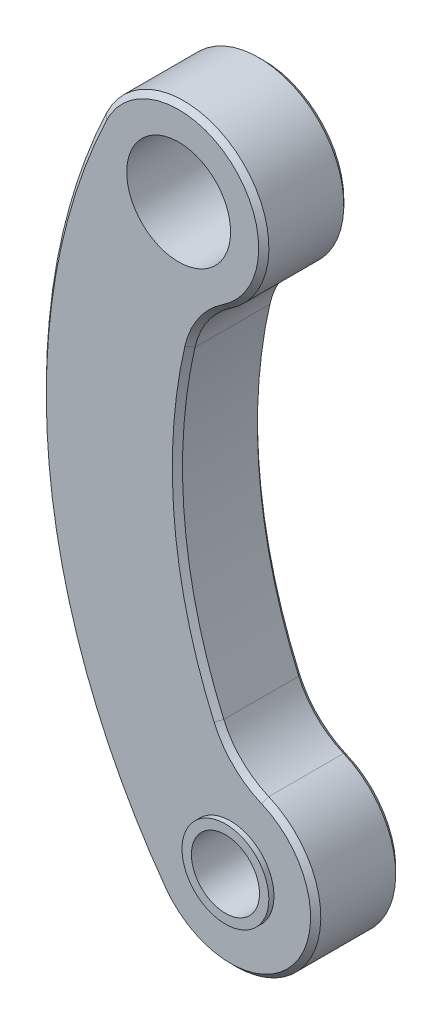
ISO-10303-21;
HEADER;
FILE_DESCRIPTION(('STEP AP214'),'2;1');
FILE_NAME('part.step','',(''),(''),'','','');
FILE_SCHEMA(('AUTOMOTIVE_DESIGN { 1 0 10303 214 1 1 1 1 }'));
ENDSEC;
DATA;
#1=APPLICATION_CONTEXT('core data for automotive mechanical design processes');
#2=APPLICATION_PROTOCOL_DEFINITION('international standard','automotive_design',2000,#1);
#3=PRODUCT_CONTEXT('',#1,'mechanical');
#4=PRODUCT('Part','Part','',(#3));
#5=PRODUCT_RELATED_PRODUCT_CATEGORY('part','',(#4));
#6=PRODUCT_DEFINITION_FORMATION('','',#4);
#7=PRODUCT_DEFINITION_CONTEXT('part definition',#1,'design');
#8=PRODUCT_DEFINITION('design','',#6,#7);
#9=PRODUCT_DEFINITION_SHAPE('','',#8);
#10=(LENGTH_UNIT() NAMED_UNIT(*) SI_UNIT(.MILLI.,.METRE.));
#11=(NAMED_UNIT(*) PLANE_ANGLE_UNIT() SI_UNIT($,.RADIAN.));
#12=(NAMED_UNIT(*) SI_UNIT($,.STERADIAN.) SOLID_ANGLE_UNIT());
#13=UNCERTAINTY_MEASURE_WITH_UNIT(LENGTH_MEASURE(1.E-05),#10,'distance_accuracy_value','');
#14=(GEOMETRIC_REPRESENTATION_CONTEXT(3) GLOBAL_UNCERTAINTY_ASSIGNED_CONTEXT((#13)) GLOBAL_UNIT_ASSIGNED_CONTEXT((#10,
#11,#12)) REPRESENTATION_CONTEXT('',''));
#15=CARTESIAN_POINT('',(0.,0.,0.));
#16=DIRECTION('',(0.,0.,1.));
#17=DIRECTION('',(1.,0.,0.));
#18=AXIS2_PLACEMENT_3D('',#15,#16,#17);
#19=CARTESIAN_POINT('',(-21.5970579139989,-26.6668240804001,-2.9));
#20=DIRECTION('',(0.,0.,1.));
#21=DIRECTION('',(1.,0.,0.));
#22=AXIS2_PLACEMENT_3D('',#19,#20,#21);
#23=PLANE('',#22);
#24=CARTESIAN_POINT('',(-18.536819643494,-42.9194012219987,-2.9));
#25=DIRECTION('',(0.,0.,1.));
#26=DIRECTION('',(1.,0.,0.));
#27=AXIS2_PLACEMENT_3D('',#24,#25,#26);
#28=CIRCLE('',#27,2.55);
#29=CARTESIAN_POINT('',(-15.986819643494,-42.9194012219987,-2.9));
#30=VERTEX_POINT('',#29);
#31=EDGE_CURVE('E11',#30,#30,#28,.T.);
#32=ORIENTED_EDGE('',*,*,#31,.T.);
#33=EDGE_LOOP('',(#32));
#34=FACE_BOUND('',#33,.T.);
#35=CARTESIAN_POINT('',(-18.536819643494,-42.9194012219987,-2.9));
#36=DIRECTION('',(0.,0.,1.));
#37=DIRECTION('',(1.,0.,0.));
#38=AXIS2_PLACEMENT_3D('',#35,#36,#37);
#39=CIRCLE('',#38,2.);
#40=CARTESIAN_POINT('',(-16.536819643494,-42.9194012219987,-2.9));
#41=VERTEX_POINT('',#40);
#42=EDGE_CURVE('E203',#41,#41,#39,.T.);
#43=ORIENTED_EDGE('',*,*,#42,.F.);
#44=EDGE_LOOP('',(#43));
#45=FACE_BOUND('',#44,.T.);
#46=ADVANCED_FACE('F17',(#34,#45),#23,.T.);
#47=CARTESIAN_POINT('',(-18.536819643494,-42.9194012219987,-2.9));
#48=DIRECTION('',(0.,0.,-1.));
#49=DIRECTION('',(-1.,0.,0.));
#50=AXIS2_PLACEMENT_3D('',#47,#48,#49);
#51=CYLINDRICAL_SURFACE('',#50,2.55);
#52=CARTESIAN_POINT('',(-18.536819643494,-42.9194012219987,-3.2));
#53=DIRECTION('',(0.,0.,1.));
#54=DIRECTION('',(1.,0.,0.));
#55=AXIS2_PLACEMENT_3D('',#52,#53,#54);
#56=CIRCLE('',#55,2.55);
#57=CARTESIAN_POINT('',(-15.986819643494,-42.9194012219987,-3.2));
#58=VERTEX_POINT('',#57);
#59=EDGE_CURVE('E303',#58,#58,#56,.T.);
#60=ORIENTED_EDGE('',*,*,#59,.T.);
#61=EDGE_LOOP('',(#60));
#62=FACE_BOUND('',#61,.T.);
#63=ORIENTED_EDGE('',*,*,#31,.F.);
#64=EDGE_LOOP('',(#63));
#65=FACE_BOUND('',#64,.T.);
#66=ADVANCED_FACE('F422',(#62,#65),#51,.T.);
#67=CARTESIAN_POINT('',(7.34270381549625,-24.0978639432433,-3.5));
#68=DIRECTION('',(0.,0.,1.));
#69=DIRECTION('',(1.,0.,0.));
#70=AXIS2_PLACEMENT_3D('',#67,#68,#69);
#71=CONICAL_SURFACE('',#70,29.,0.785398163397466);
#72=DIRECTION('',(-0.689296284094153,0.157704257184148,0.707106781186539));
#73=VECTOR('',#72,1.);
#74=CARTESIAN_POINT('',(-20.926848634824,-17.6300664619829,-3.5));
#75=LINE('',#74,#73);
#76=CARTESIAN_POINT('',(-20.926848634824,-17.6300664619829,-3.5));
#77=VERTEX_POINT('',#76);
#78=CARTESIAN_POINT('',(-21.2192922808618,-17.5631582121767,-3.2));
#79=VERTEX_POINT('',#78);
#80=EDGE_CURVE('E202',#77,#79,#75,.T.);
#81=ORIENTED_EDGE('',*,*,#80,.T.);
#82=CARTESIAN_POINT('',(7.34270381549625,-24.0978639432433,-3.2));
#83=DIRECTION('',(0.,0.,-1.));
#84=DIRECTION('',(1.,0.,0.));
#85=AXIS2_PLACEMENT_3D('',#82,#83,#84);
#86=CIRCLE('',#85,29.3);
#87=CARTESIAN_POINT('',(-19.507090340175,-35.8272524097443,-3.2));
#88=VERTEX_POINT('',#87);
#89=EDGE_CURVE('E283',#88,#79,#86,.T.);
#90=ORIENTED_EDGE('',*,*,#89,.F.);
#91=DIRECTION('',(0.647975137233395,0.283069287502871,-0.707106781186534));
#92=VECTOR('',#91,1.);
#93=CARTESIAN_POINT('',(-19.507090340175,-35.8272524097443,-3.2));
#94=LINE('',#93,#92);
#95=CARTESIAN_POINT('',(-19.2321777720282,-35.707156282101,-3.5));
#96=VERTEX_POINT('',#95);
#97=EDGE_CURVE('E25',#88,#96,#94,.T.);
#98=ORIENTED_EDGE('',*,*,#97,.T.);
#99=CARTESIAN_POINT('',(7.34270381549625,-24.0978639432433,-3.5));
#100=DIRECTION('',(0.,0.,1.));
#101=DIRECTION('',(1.,0.,0.));
#102=AXIS2_PLACEMENT_3D('',#99,#100,#101);
#103=CIRCLE('',#102,29.);
#104=EDGE_CURVE('E227',#77,#96,#103,.T.);
#105=ORIENTED_EDGE('',*,*,#104,.F.);
#106=EDGE_LOOP('',(#81,#90,#98,#105));
#107=FACE_BOUND('',#106,.T.);
#108=ADVANCED_FACE('F281',(#107),#71,.F.);
#109=CARTESIAN_POINT('',(-14.6503016362481,-33.7055541547117,-3.5));
#110=DIRECTION('',(0.,0.,1.));
#111=DIRECTION('',(1.,0.,0.));
#112=AXIS2_PLACEMENT_3D('',#109,#110,#111);
#113=CONICAL_SURFACE('',#112,5.,0.785398163397465);
#114=DIRECTION('',(0.274818323812714,0.651517374209452,-0.707106781186541));
#115=VECTOR('',#114,1.);
#116=CARTESIAN_POINT('',(-16.7101561800884,-38.5888931003738,-3.2));
#117=LINE('',#116,#115);
#118=CARTESIAN_POINT('',(-16.7101561800884,-38.5888931003738,-3.2));
#119=VERTEX_POINT('',#118);
#120=CARTESIAN_POINT('',(-16.593560639871,-38.3124776883552,-3.5));
#121=VERTEX_POINT('',#120);
#122=EDGE_CURVE('E273',#119,#121,#117,.T.);
#123=ORIENTED_EDGE('',*,*,#122,.T.);
#124=CARTESIAN_POINT('',(-14.6503016362481,-33.7055541547117,-3.5));
#125=DIRECTION('',(0.,0.,1.));
#126=DIRECTION('',(1.,0.,0.));
#127=AXIS2_PLACEMENT_3D('',#124,#125,#126);
#128=CIRCLE('',#127,5.);
#129=EDGE_CURVE('E232',#96,#121,#128,.T.);
#130=ORIENTED_EDGE('',*,*,#129,.F.);
#131=ORIENTED_EDGE('',*,*,#97,.F.);
#132=CARTESIAN_POINT('',(-14.6503016362481,-33.7055541547117,-3.2));
#133=DIRECTION('',(0.,0.,-1.));
#134=DIRECTION('',(1.,0.,0.));
#135=AXIS2_PLACEMENT_3D('',#132,#133,#134);
#136=CIRCLE('',#135,5.3);
#137=EDGE_CURVE('E298',#119,#88,#136,.T.);
#138=ORIENTED_EDGE('',*,*,#137,.F.);
#139=EDGE_LOOP('',(#123,#130,#131,#138));
#140=FACE_BOUND('',#139,.T.);
#141=ADVANCED_FACE('F413',(#140),#113,.F.);
#142=CARTESIAN_POINT('',(-16.0527878675274,-18.7452039587519,-3.2));
#143=DIRECTION('',(0.,0.,1.));
#144=DIRECTION('',(1.,0.,0.));
#145=AXIS2_PLACEMENT_3D('',#142,#143,#144);
#146=CONICAL_SURFACE('',#145,5.3,0.785398163397463);
#147=DIRECTION('',(-0.391121177716956,0.589087620258063,0.707106781186543));
#148=VECTOR('',#147,1.);
#149=CARTESIAN_POINT('',(-18.8184322378207,-14.5797254487767,-3.5));
#150=LINE('',#149,#148);
#151=CARTESIAN_POINT('',(-18.8184322378207,-14.5797254487767,-3.5));
#152=VERTEX_POINT('',#151);
#153=CARTESIAN_POINT('',(-18.9843709000382,-14.3297967381782,-3.2));
#154=VERTEX_POINT('',#153);
#155=EDGE_CURVE('E270',#152,#154,#150,.T.);
#156=ORIENTED_EDGE('',*,*,#155,.T.);
#157=CARTESIAN_POINT('',(-16.0527878675274,-18.7452039587519,-3.2));
#158=DIRECTION('',(0.,0.,-1.));
#159=DIRECTION('',(1.,0.,0.));
#160=AXIS2_PLACEMENT_3D('',#157,#158,#159);
#161=CIRCLE('',#160,5.3);
#162=EDGE_CURVE('E288',#79,#154,#161,.T.);
#163=ORIENTED_EDGE('',*,*,#162,.F.);
#164=ORIENTED_EDGE('',*,*,#80,.F.);
#165=CARTESIAN_POINT('',(-16.0527878675274,-18.7452039587519,-3.5));
#166=DIRECTION('',(0.,0.,1.));
#167=DIRECTION('',(1.,0.,0.));
#168=AXIS2_PLACEMENT_3D('',#165,#166,#167);
#169=CIRCLE('',#168,5.);
#170=EDGE_CURVE('E240',#152,#77,#169,.T.);
#171=ORIENTED_EDGE('',*,*,#170,.F.);
#172=EDGE_LOOP('',(#156,#163,#164,#171));
#173=FACE_BOUND('',#172,.T.);
#174=ADVANCED_FACE('F289',(#173),#146,.F.);
#175=CARTESIAN_POINT('',(-18.536819643494,-42.9194012219987,-3.5));
#176=DIRECTION('',(0.,0.,-1.));
#177=DIRECTION('',(-1.,0.,0.));
#178=AXIS2_PLACEMENT_3D('',#175,#176,#177);
#179=CONICAL_SURFACE('',#178,5.,0.78539816339746);
#180=DIRECTION('',(-0.571862079116511,-0.415901145067595,-0.707106781186551));
#181=VECTOR('',#180,1.);
#182=CARTESIAN_POINT('',(-22.3378746515332,-45.6838145098159,-3.2));
#183=LINE('',#182,#181);
#184=CARTESIAN_POINT('',(-22.3378746515332,-45.6838145098159,-3.2));
#185=VERTEX_POINT('',#184);
#186=CARTESIAN_POINT('',(-22.5804951839612,-45.8602664218042,-3.5));
#187=VERTEX_POINT('',#186);
#188=EDGE_CURVE('E264',#185,#187,#183,.T.);
#189=ORIENTED_EDGE('',*,*,#188,.T.);
#190=CARTESIAN_POINT('',(-18.536819643494,-42.9194012219987,-3.5));
#191=DIRECTION('',(0.,0.,-1.));
#192=DIRECTION('',(1.,0.,0.));
#193=AXIS2_PLACEMENT_3D('',#190,#191,#192);
#194=CIRCLE('',#193,5.);
#195=EDGE_CURVE('E308',#121,#187,#194,.T.);
#196=ORIENTED_EDGE('',*,*,#195,.F.);
#197=ORIENTED_EDGE('',*,*,#122,.F.);
#198=CARTESIAN_POINT('',(-18.536819643494,-42.9194012219987,-3.2));
#199=DIRECTION('',(0.,0.,1.));
#200=DIRECTION('',(1.,0.,0.));
#201=AXIS2_PLACEMENT_3D('',#198,#199,#200);
#202=CIRCLE('',#201,4.7);
#203=EDGE_CURVE('E169',#185,#119,#202,.T.);
#204=ORIENTED_EDGE('',*,*,#203,.F.);
#205=EDGE_LOOP('',(#189,#196,#197,#204));
#206=FACE_BOUND('',#205,.T.);
#207=ADVANCED_FACE('F411',(#206),#179,.T.);
#208=CARTESIAN_POINT('',(-21.5840766081139,-10.4142469388015,-3.5));
#209=DIRECTION('',(0.,0.,-1.));
#210=DIRECTION('',(-1.,0.,0.));
#211=AXIS2_PLACEMENT_3D('',#208,#209,#210);
#212=CONICAL_SURFACE('',#211,5.,0.78539816339746);
#213=DIRECTION('',(0.63919758110716,-0.302368074218761,0.707106781186543));
#214=VECTOR('',#213,1.);
#215=CARTESIAN_POINT('',(-26.103886049303,-8.27618178185753,-3.5));
#216=LINE('',#215,#214);
#217=CARTESIAN_POINT('',(-26.103886049303,-8.27618178185753,-3.5));
#218=VERTEX_POINT('',#217);
#219=CARTESIAN_POINT('',(-25.8326974828317,-8.40446569127418,-3.2));
#220=VERTEX_POINT('',#219);
#221=EDGE_CURVE('E267',#218,#220,#216,.T.);
#222=ORIENTED_EDGE('',*,*,#221,.T.);
#223=CARTESIAN_POINT('',(-21.5840766081139,-10.4142469388015,-3.2));
#224=DIRECTION('',(0.,0.,1.));
#225=DIRECTION('',(1.,0.,0.));
#226=AXIS2_PLACEMENT_3D('',#223,#224,#225);
#227=CIRCLE('',#226,4.7);
#228=EDGE_CURVE('E294',#154,#220,#227,.T.);
#229=ORIENTED_EDGE('',*,*,#228,.F.);
#230=ORIENTED_EDGE('',*,*,#155,.F.);
#231=CARTESIAN_POINT('',(-21.5840766081139,-10.4142469388015,-3.5));
#232=DIRECTION('',(0.,0.,-1.));
#233=DIRECTION('',(1.,0.,0.));
#234=AXIS2_PLACEMENT_3D('',#231,#232,#233);
#235=CIRCLE('',#234,5.);
#236=EDGE_CURVE('E331',#218,#152,#235,.T.);
#237=ORIENTED_EDGE('',*,*,#236,.F.);
#238=EDGE_LOOP('',(#222,#229,#230,#237));
#239=FACE_BOUND('',#238,.T.);
#240=ADVANCED_FACE('F404',(#239),#212,.T.);
#241=CARTESIAN_POINT('',(7.3427038154962,-24.0978639432433,-3.2));
#242=DIRECTION('',(0.,0.,-1.));
#243=DIRECTION('',(-1.,0.,0.));
#244=AXIS2_PLACEMENT_3D('',#241,#242,#243);
#245=CONICAL_SURFACE('',#244,36.7,0.785398163397455);
#246=ORIENTED_EDGE('',*,*,#188,.F.);
#247=CARTESIAN_POINT('',(7.3427038154962,-24.0978639432433,-3.2));
#248=DIRECTION('',(0.,0.,1.));
#249=DIRECTION('',(1.,0.,0.));
#250=AXIS2_PLACEMENT_3D('',#247,#248,#249);
#251=CIRCLE('',#250,36.7);
#252=EDGE_CURVE('E179',#220,#185,#251,.T.);
#253=ORIENTED_EDGE('',*,*,#252,.F.);
#254=ORIENTED_EDGE('',*,*,#221,.F.);
#255=CARTESIAN_POINT('',(7.3427038154962,-24.0978639432433,-3.5));
#256=DIRECTION('',(0.,0.,-1.));
#257=DIRECTION('',(1.,0.,0.));
#258=AXIS2_PLACEMENT_3D('',#255,#256,#257);
#259=CIRCLE('',#258,37.);
#260=EDGE_CURVE('E322',#187,#218,#259,.T.);
#261=ORIENTED_EDGE('',*,*,#260,.F.);
#262=EDGE_LOOP('',(#246,#253,#254,#261));
#263=FACE_BOUND('',#262,.T.);
#264=ADVANCED_FACE('F408',(#263),#245,.T.);
#265=CARTESIAN_POINT('',(7.34270381549625,-24.0978639432433,-7.9));
#266=DIRECTION('',(0.,0.,-1.));
#267=DIRECTION('',(-1.,0.,0.));
#268=AXIS2_PLACEMENT_3D('',#265,#266,#267);
#269=CONICAL_SURFACE('',#268,29.,0.785398163397436);
#270=DIRECTION('',(-0.647975137233374,-0.283069287502869,-0.707106781186553));
#271=VECTOR('',#270,1.);
#272=CARTESIAN_POINT('',(-19.2321777720281,-35.707156282101,-7.9));
#273=LINE('',#272,#271);
#274=CARTESIAN_POINT('',(-19.2321777720282,-35.707156282101,-7.9));
#275=VERTEX_POINT('',#274);
#276=CARTESIAN_POINT('',(-19.507090340175,-35.8272524097443,-8.2));
#277=VERTEX_POINT('',#276);
#278=EDGE_CURVE('E260',#275,#277,#273,.T.);
#279=ORIENTED_EDGE('',*,*,#278,.T.);
#280=CARTESIAN_POINT('',(7.34270381549625,-24.0978639432433,-8.2));
#281=DIRECTION('',(0.,0.,1.));
#282=DIRECTION('',(-1.,0.,0.));
#283=AXIS2_PLACEMENT_3D('',#280,#281,#282);
#284=CIRCLE('',#283,29.3);
#285=CARTESIAN_POINT('',(-21.2192922808617,-17.5631582121767,-8.2));
#286=VERTEX_POINT('',#285);
#287=EDGE_CURVE('E176',#286,#277,#284,.T.);
#288=ORIENTED_EDGE('',*,*,#287,.F.);
#289=DIRECTION('',(0.689296284094133,-0.157704257184155,0.707106781186558));
#290=VECTOR('',#289,1.);
#291=CARTESIAN_POINT('',(-21.2192922808617,-17.5631582121767,-8.2));
#292=LINE('',#291,#290);
#293=CARTESIAN_POINT('',(-20.926848634824,-17.6300664619829,-7.9));
#294=VERTEX_POINT('',#293);
#295=EDGE_CURVE('E261',#286,#294,#292,.T.);
#296=ORIENTED_EDGE('',*,*,#295,.T.);
#297=CARTESIAN_POINT('',(7.34270381549625,-24.0978639432433,-7.9));
#298=DIRECTION('',(0.,0.,-1.));
#299=DIRECTION('',(-1.,0.,0.));
#300=AXIS2_PLACEMENT_3D('',#297,#298,#299);
#301=CIRCLE('',#300,29.);
#302=EDGE_CURVE('E219',#275,#294,#301,.T.);
#303=ORIENTED_EDGE('',*,*,#302,.F.);
#304=EDGE_LOOP('',(#279,#288,#296,#303));
#305=FACE_BOUND('',#304,.T.);
#306=ADVANCED_FACE('F362',(#305),#269,.F.);
#307=CARTESIAN_POINT('',(-16.0527878675274,-18.7452039587519,-8.2));
#308=DIRECTION('',(0.,0.,-1.));
#309=DIRECTION('',(-1.,0.,0.));
#310=AXIS2_PLACEMENT_3D('',#307,#308,#309);
#311=CONICAL_SURFACE('',#310,5.3,0.785398163397434);
#312=DIRECTION('',(0.391121177716955,-0.589087620258062,0.707106781186544));
#313=VECTOR('',#312,1.);
#314=CARTESIAN_POINT('',(-18.9843709000382,-14.3297967381782,-8.2));
#315=LINE('',#314,#313);
#316=CARTESIAN_POINT('',(-18.9843709000382,-14.3297967381782,-8.2));
#317=VERTEX_POINT('',#316);
#318=CARTESIAN_POINT('',(-18.8184322378207,-14.5797254487767,-7.9));
#319=VERTEX_POINT('',#318);
#320=EDGE_CURVE('E257',#317,#319,#315,.T.);
#321=ORIENTED_EDGE('',*,*,#320,.T.);
#322=CARTESIAN_POINT('',(-16.0527878675274,-18.7452039587519,-7.9));
#323=DIRECTION('',(0.,0.,-1.));
#324=DIRECTION('',(-1.,0.,0.));
#325=AXIS2_PLACEMENT_3D('',#322,#323,#324);
#326=CIRCLE('',#325,5.);
#327=EDGE_CURVE('E236',#294,#319,#326,.T.);
#328=ORIENTED_EDGE('',*,*,#327,.F.);
#329=ORIENTED_EDGE('',*,*,#295,.F.);
#330=CARTESIAN_POINT('',(-16.0527878675274,-18.7452039587519,-8.2));
#331=DIRECTION('',(0.,0.,1.));
#332=DIRECTION('',(-1.,0.,0.));
#333=AXIS2_PLACEMENT_3D('',#330,#331,#332);
#334=CIRCLE('',#333,5.3);
#335=EDGE_CURVE('E168',#317,#286,#334,.T.);
#336=ORIENTED_EDGE('',*,*,#335,.F.);
#337=EDGE_LOOP('',(#321,#328,#329,#336));
#338=FACE_BOUND('',#337,.T.);
#339=ADVANCED_FACE('F373',(#338),#311,.F.);
#340=CARTESIAN_POINT('',(-14.6503016362481,-33.7055541547117,-7.9));
#341=DIRECTION('',(0.,0.,-1.));
#342=DIRECTION('',(-1.,0.,0.));
#343=AXIS2_PLACEMENT_3D('',#340,#341,#342);
#344=CONICAL_SURFACE('',#343,5.,0.785398163397436);
#345=DIRECTION('',(-0.274818323812716,-0.651517374209442,-0.70710678118655));
#346=VECTOR('',#345,1.);
#347=CARTESIAN_POINT('',(-16.593560639871,-38.3124776883552,-7.9));
#348=LINE('',#347,#346);
#349=CARTESIAN_POINT('',(-16.593560639871,-38.3124776883552,-7.9));
#350=VERTEX_POINT('',#349);
#351=CARTESIAN_POINT('',(-16.7101561800884,-38.5888931003738,-8.2));
#352=VERTEX_POINT('',#351);
#353=EDGE_CURVE('E254',#350,#352,#348,.T.);
#354=ORIENTED_EDGE('',*,*,#353,.T.);
#355=CARTESIAN_POINT('',(-14.6503016362481,-33.7055541547117,-8.2));
#356=DIRECTION('',(0.,0.,1.));
#357=DIRECTION('',(-1.,0.,0.));
#358=AXIS2_PLACEMENT_3D('',#355,#356,#357);
#359=CIRCLE('',#358,5.3);
#360=EDGE_CURVE('E186',#277,#352,#359,.T.);
#361=ORIENTED_EDGE('',*,*,#360,.F.);
#362=ORIENTED_EDGE('',*,*,#278,.F.);
#363=CARTESIAN_POINT('',(-14.6503016362481,-33.7055541547117,-7.9));
#364=DIRECTION('',(0.,0.,-1.));
#365=DIRECTION('',(-1.,0.,0.));
#366=AXIS2_PLACEMENT_3D('',#363,#364,#365);
#367=CIRCLE('',#366,5.);
#368=EDGE_CURVE('E231',#350,#275,#367,.T.);
#369=ORIENTED_EDGE('',*,*,#368,.F.);
#370=EDGE_LOOP('',(#354,#361,#362,#369));
#371=FACE_BOUND('',#370,.T.);
#372=ADVANCED_FACE('F366',(#371),#344,.F.);
#373=CARTESIAN_POINT('',(-21.5840766081139,-10.4142469388015,-8.2));
#374=DIRECTION('',(0.,0.,1.));
#375=DIRECTION('',(1.,0.,0.));
#376=AXIS2_PLACEMENT_3D('',#373,#374,#375);
#377=CONICAL_SURFACE('',#376,4.7,0.785398163397452);
#378=DIRECTION('',(-0.639197581107155,0.302368074218759,0.707106781186548));
#379=VECTOR('',#378,1.);
#380=CARTESIAN_POINT('',(-25.8326974828317,-8.40446569127417,-8.2));
#381=LINE('',#380,#379);
#382=CARTESIAN_POINT('',(-25.8326974828317,-8.40446569127417,-8.2));
#383=VERTEX_POINT('',#382);
#384=CARTESIAN_POINT('',(-26.103886049303,-8.27618178185753,-7.9));
#385=VERTEX_POINT('',#384);
#386=EDGE_CURVE('E248',#383,#385,#381,.T.);
#387=ORIENTED_EDGE('',*,*,#386,.T.);
#388=CARTESIAN_POINT('',(-21.5840766081139,-10.4142469388015,-7.9));
#389=DIRECTION('',(0.,0.,1.));
#390=DIRECTION('',(-1.,0.,0.));
#391=AXIS2_PLACEMENT_3D('',#388,#389,#390);
#392=CIRCLE('',#391,5.);
#393=EDGE_CURVE('E348',#319,#385,#392,.T.);
#394=ORIENTED_EDGE('',*,*,#393,.F.);
#395=ORIENTED_EDGE('',*,*,#320,.F.);
#396=CARTESIAN_POINT('',(-21.5840766081139,-10.4142469388015,-8.2));
#397=DIRECTION('',(0.,0.,-1.));
#398=DIRECTION('',(-1.,0.,0.));
#399=AXIS2_PLACEMENT_3D('',#396,#397,#398);
#400=CIRCLE('',#399,4.7);
#401=EDGE_CURVE('E191',#383,#317,#400,.T.);
#402=ORIENTED_EDGE('',*,*,#401,.F.);
#403=EDGE_LOOP('',(#387,#394,#395,#402));
#404=FACE_BOUND('',#403,.T.);
#405=ADVANCED_FACE('F398',(#404),#377,.T.);
#406=CARTESIAN_POINT('',(-18.536819643494,-42.9194012219987,-8.2));
#407=DIRECTION('',(0.,0.,1.));
#408=DIRECTION('',(1.,0.,0.));
#409=AXIS2_PLACEMENT_3D('',#406,#407,#408);
#410=CONICAL_SURFACE('',#409,4.7,0.785398163397452);
#411=DIRECTION('',(0.571862079116504,0.415901145067596,-0.707106781186556));
#412=VECTOR('',#411,1.);
#413=CARTESIAN_POINT('',(-22.5804951839612,-45.8602664218042,-7.9));
#414=LINE('',#413,#412);
#415=CARTESIAN_POINT('',(-22.5804951839612,-45.8602664218042,-7.9));
#416=VERTEX_POINT('',#415);
#417=CARTESIAN_POINT('',(-22.3378746515332,-45.6838145098159,-8.2));
#418=VERTEX_POINT('',#417);
#419=EDGE_CURVE('E251',#416,#418,#414,.T.);
#420=ORIENTED_EDGE('',*,*,#419,.T.);
#421=CARTESIAN_POINT('',(-18.536819643494,-42.9194012219987,-8.2));
#422=DIRECTION('',(0.,0.,-1.));
#423=DIRECTION('',(-1.,0.,0.));
#424=AXIS2_PLACEMENT_3D('',#421,#422,#423);
#425=CIRCLE('',#424,4.7);
#426=EDGE_CURVE('E195',#352,#418,#425,.T.);
#427=ORIENTED_EDGE('',*,*,#426,.F.);
#428=ORIENTED_EDGE('',*,*,#353,.F.);
#429=CARTESIAN_POINT('',(-18.536819643494,-42.9194012219987,-7.9));
#430=DIRECTION('',(0.,0.,1.));
#431=DIRECTION('',(-1.,0.,0.));
#432=AXIS2_PLACEMENT_3D('',#429,#430,#431);
#433=CIRCLE('',#432,5.);
#434=EDGE_CURVE('E318',#416,#350,#433,.T.);
#435=ORIENTED_EDGE('',*,*,#434,.F.);
#436=EDGE_LOOP('',(#420,#427,#428,#435));
#437=FACE_BOUND('',#436,.T.);
#438=ADVANCED_FACE('F391',(#437),#410,.T.);
#439=CARTESIAN_POINT('',(7.3427038154962,-24.0978639432433,-7.9));
#440=DIRECTION('',(0.,0.,1.));
#441=DIRECTION('',(1.,0.,0.));
#442=AXIS2_PLACEMENT_3D('',#439,#440,#441);
#443=CONICAL_SURFACE('',#442,37.,0.785398163397451);
#444=ORIENTED_EDGE('',*,*,#386,.F.);
#445=CARTESIAN_POINT('',(7.3427038154962,-24.0978639432433,-8.2));
#446=DIRECTION('',(0.,0.,-1.));
#447=DIRECTION('',(-1.,0.,0.));
#448=AXIS2_PLACEMENT_3D('',#445,#446,#447);
#449=CIRCLE('',#448,36.7);
#450=EDGE_CURVE('E199',#418,#383,#449,.T.);
#451=ORIENTED_EDGE('',*,*,#450,.F.);
#452=ORIENTED_EDGE('',*,*,#419,.F.);
#453=CARTESIAN_POINT('',(7.3427038154962,-24.0978639432433,-7.9));
#454=DIRECTION('',(0.,0.,1.));
#455=DIRECTION('',(-1.,0.,0.));
#456=AXIS2_PLACEMENT_3D('',#453,#454,#455);
#457=CIRCLE('',#456,37.);
#458=EDGE_CURVE('E327',#385,#416,#457,.T.);
#459=ORIENTED_EDGE('',*,*,#458,.F.);
#460=EDGE_LOOP('',(#444,#451,#452,#459));
#461=FACE_BOUND('',#460,.T.);
#462=ADVANCED_FACE('F394',(#461),#443,.T.);
#463=CARTESIAN_POINT('',(-18.536819643494,-42.9194012219987,-27.4));
#464=DIRECTION('',(0.,0.,1.));
#465=DIRECTION('',(1.,0.,0.));
#466=AXIS2_PLACEMENT_3D('',#463,#464,#465);
#467=CYLINDRICAL_SURFACE('',#466,1.6);
#468=CARTESIAN_POINT('',(-18.536819643494,-42.9194012219987,-7.4));
#469=DIRECTION('',(0.,0.,1.));
#470=DIRECTION('',(1.,0.,0.));
#471=AXIS2_PLACEMENT_3D('',#468,#469,#470);
#472=CIRCLE('',#471,1.6);
#473=CARTESIAN_POINT('',(-16.936819643494,-42.9194012219987,-7.4));
#474=VERTEX_POINT('',#473);
#475=EDGE_CURVE('E40',#474,#474,#472,.T.);
#476=ORIENTED_EDGE('',*,*,#475,.T.);
#477=EDGE_LOOP('',(#476));
#478=FACE_BOUND('',#477,.T.);
#479=CARTESIAN_POINT('',(-18.536819643494,-42.9194012219987,-8.2));
#480=DIRECTION('',(0.,0.,-1.));
#481=DIRECTION('',(-1.,0.,0.));
#482=AXIS2_PLACEMENT_3D('',#479,#480,#481);
#483=CIRCLE('',#482,1.6);
#484=CARTESIAN_POINT('',(-20.136819643494,-42.9194012219987,-8.2));
#485=VERTEX_POINT('',#484);
#486=EDGE_CURVE('E187',#485,#485,#483,.T.);
#487=ORIENTED_EDGE('',*,*,#486,.T.);
#488=EDGE_LOOP('',(#487));
#489=FACE_BOUND('',#488,.T.);
#490=ADVANCED_FACE('F441',(#478,#489),#467,.F.);
#491=CARTESIAN_POINT('',(-20.5854481258039,-26.1418240804001,-7.4));
#492=DIRECTION('',(0.,0.,1.));
#493=DIRECTION('',(1.,0.,0.));
#494=AXIS2_PLACEMENT_3D('',#491,#492,#493);
#495=PLANE('',#494);
#496=CARTESIAN_POINT('',(-18.536819643494,-42.9194012219987,-7.4));
#497=DIRECTION('',(0.,0.,1.));
#498=DIRECTION('',(1.,0.,0.));
#499=AXIS2_PLACEMENT_3D('',#496,#497,#498);
#500=CIRCLE('',#499,2.);
#501=CARTESIAN_POINT('',(-16.536819643494,-42.9194012219987,-7.4));
#502=VERTEX_POINT('',#501);
#503=EDGE_CURVE('E206',#502,#502,#500,.T.);
#504=ORIENTED_EDGE('',*,*,#503,.T.);
#505=EDGE_LOOP('',(#504));
#506=FACE_BOUND('',#505,.T.);
#507=ORIENTED_EDGE('',*,*,#475,.F.);
#508=EDGE_LOOP('',(#507));
#509=FACE_BOUND('',#508,.T.);
#510=ADVANCED_FACE('F435',(#506,#509),#495,.T.);
#511=CARTESIAN_POINT('',(-18.536819643494,-42.9194012219987,-7.4));
#512=DIRECTION('',(0.,0.,1.));
#513=DIRECTION('',(1.,0.,0.));
#514=AXIS2_PLACEMENT_3D('',#511,#512,#513);
#515=CYLINDRICAL_SURFACE('',#514,2.);
#516=ORIENTED_EDGE('',*,*,#42,.T.);
#517=EDGE_LOOP('',(#516));
#518=FACE_BOUND('',#517,.T.);
#519=ORIENTED_EDGE('',*,*,#503,.F.);
#520=EDGE_LOOP('',(#519));
#521=FACE_BOUND('',#520,.T.);
#522=ADVANCED_FACE('F432',(#518,#521),#515,.F.);
#523=CARTESIAN_POINT('',(-16.0527878675274,-18.7452039587519,-126.022840412693));
#524=DIRECTION('',(0.,0.,1.));
#525=DIRECTION('',(1.,0.,0.));
#526=AXIS2_PLACEMENT_3D('',#523,#524,#525);
#527=CYLINDRICAL_SURFACE('',#526,5.);
#528=DIRECTION('',(0.,0.,1.));
#529=VECTOR('',#528,1.);
#530=CARTESIAN_POINT('',(-20.926848634824,-17.6300664619829,-126.022840412693));
#531=LINE('',#530,#529);
#532=EDGE_CURVE('E223',#294,#77,#531,.T.);
#533=ORIENTED_EDGE('',*,*,#532,.F.);
#534=ORIENTED_EDGE('',*,*,#327,.T.);
#535=DIRECTION('',(0.,0.,1.));
#536=VECTOR('',#535,1.);
#537=CARTESIAN_POINT('',(-18.8184322378207,-14.5797254487767,-126.022840412693));
#538=LINE('',#537,#536);
#539=EDGE_CURVE('E352',#319,#152,#538,.T.);
#540=ORIENTED_EDGE('',*,*,#539,.T.);
#541=ORIENTED_EDGE('',*,*,#170,.T.);
#542=EDGE_LOOP('',(#533,#534,#540,#541));
#543=FACE_BOUND('',#542,.T.);
#544=ADVANCED_FACE('F378',(#543),#527,.F.);
#545=CARTESIAN_POINT('',(-14.6503016362481,-33.7055541547117,-126.022840412693));
#546=DIRECTION('',(0.,0.,1.));
#547=DIRECTION('',(1.,0.,0.));
#548=AXIS2_PLACEMENT_3D('',#545,#546,#547);
#549=CYLINDRICAL_SURFACE('',#548,5.);
#550=DIRECTION('',(0.,0.,1.));
#551=VECTOR('',#550,1.);
#552=CARTESIAN_POINT('',(-16.593560639871,-38.3124776883552,-126.022840412693));
#553=LINE('',#552,#551);
#554=EDGE_CURVE('E312',#350,#121,#553,.T.);
#555=ORIENTED_EDGE('',*,*,#554,.F.);
#556=ORIENTED_EDGE('',*,*,#368,.T.);
#557=DIRECTION('',(0.,0.,1.));
#558=VECTOR('',#557,1.);
#559=CARTESIAN_POINT('',(-19.2321777720282,-35.707156282101,-126.022840412693));
#560=LINE('',#559,#558);
#561=EDGE_CURVE('E215',#275,#96,#560,.T.);
#562=ORIENTED_EDGE('',*,*,#561,.T.);
#563=ORIENTED_EDGE('',*,*,#129,.T.);
#564=EDGE_LOOP('',(#555,#556,#562,#563));
#565=FACE_BOUND('',#564,.T.);
#566=ADVANCED_FACE('F383',(#565),#549,.F.);
#567=CARTESIAN_POINT('',(7.34270381549625,-24.0978639432433,-126.022840412693));
#568=DIRECTION('',(0.,0.,1.));
#569=DIRECTION('',(1.,0.,0.));
#570=AXIS2_PLACEMENT_3D('',#567,#568,#569);
#571=CYLINDRICAL_SURFACE('',#570,29.);
#572=ORIENTED_EDGE('',*,*,#561,.F.);
#573=ORIENTED_EDGE('',*,*,#302,.T.);
#574=ORIENTED_EDGE('',*,*,#532,.T.);
#575=ORIENTED_EDGE('',*,*,#104,.T.);
#576=EDGE_LOOP('',(#572,#573,#574,#575));
#577=FACE_BOUND('',#576,.T.);
#578=ADVANCED_FACE('F380',(#577),#571,.F.);
#579=CARTESIAN_POINT('',(-21.5840766081139,-10.4142469388015,-27.4));
#580=DIRECTION('',(0.,0.,1.));
#581=DIRECTION('',(1.,0.,0.));
#582=AXIS2_PLACEMENT_3D('',#579,#580,#581);
#583=CYLINDRICAL_SURFACE('',#582,3.05);
#584=CARTESIAN_POINT('',(-21.5840766081139,-10.4142469388015,-3.2));
#585=DIRECTION('',(0.,0.,1.));
#586=DIRECTION('',(1.,0.,0.));
#587=AXIS2_PLACEMENT_3D('',#584,#585,#586);
#588=CIRCLE('',#587,3.05);
#589=CARTESIAN_POINT('',(-18.5340766081139,-10.4142469388015,-3.2));
#590=VERTEX_POINT('',#589);
#591=EDGE_CURVE('E163',#590,#590,#588,.T.);
#592=ORIENTED_EDGE('',*,*,#591,.T.);
#593=EDGE_LOOP('',(#592));
#594=FACE_BOUND('',#593,.T.);
#595=CARTESIAN_POINT('',(-21.5840766081139,-10.4142469388015,-8.2));
#596=DIRECTION('',(0.,0.,-1.));
#597=DIRECTION('',(-1.,0.,0.));
#598=AXIS2_PLACEMENT_3D('',#595,#596,#597);
#599=CIRCLE('',#598,3.05);
#600=CARTESIAN_POINT('',(-24.6340766081139,-10.4142469388015,-8.2));
#601=VERTEX_POINT('',#600);
#602=EDGE_CURVE('E190',#601,#601,#599,.T.);
#603=ORIENTED_EDGE('',*,*,#602,.T.);
#604=EDGE_LOOP('',(#603));
#605=FACE_BOUND('',#604,.T.);
#606=ADVANCED_FACE('F164',(#594,#605),#583,.F.);
#607=CARTESIAN_POINT('',(-31.0424017645318,0.,-8.2));
#608=DIRECTION('',(0.,0.,-1.));
#609=DIRECTION('',(0.,-1.,0.));
#610=AXIS2_PLACEMENT_3D('',#607,#608,#609);
#611=PLANE('',#610);
#612=ORIENTED_EDGE('',*,*,#602,.F.);
#613=EDGE_LOOP('',(#612));
#614=FACE_BOUND('',#613,.T.);
#615=ORIENTED_EDGE('',*,*,#486,.F.);
#616=EDGE_LOOP('',(#615));
#617=FACE_BOUND('',#616,.T.);
#618=ORIENTED_EDGE('',*,*,#335,.T.);
#619=ORIENTED_EDGE('',*,*,#287,.T.);
#620=ORIENTED_EDGE('',*,*,#360,.T.);
#621=ORIENTED_EDGE('',*,*,#426,.T.);
#622=ORIENTED_EDGE('',*,*,#450,.T.);
#623=ORIENTED_EDGE('',*,*,#401,.T.);
#624=EDGE_LOOP('',(#618,#619,#620,#621,#622,#623));
#625=FACE_BOUND('',#624,.T.);
#626=ADVANCED_FACE('F369',(#614,#617,#625),#611,.T.);
#627=CARTESIAN_POINT('',(-21.5970579139989,-26.6668240804001,-3.2));
#628=DIRECTION('',(0.,0.,1.));
#629=DIRECTION('',(1.,0.,0.));
#630=AXIS2_PLACEMENT_3D('',#627,#628,#629);
#631=PLANE('',#630);
#632=ORIENTED_EDGE('',*,*,#591,.F.);
#633=EDGE_LOOP('',(#632));
#634=FACE_BOUND('',#633,.T.);
#635=ORIENTED_EDGE('',*,*,#137,.T.);
#636=ORIENTED_EDGE('',*,*,#89,.T.);
#637=ORIENTED_EDGE('',*,*,#162,.T.);
#638=ORIENTED_EDGE('',*,*,#228,.T.);
#639=ORIENTED_EDGE('',*,*,#252,.T.);
#640=ORIENTED_EDGE('',*,*,#203,.T.);
#641=EDGE_LOOP('',(#635,#636,#637,#638,#639,#640));
#642=FACE_BOUND('',#641,.T.);
#643=ORIENTED_EDGE('',*,*,#59,.F.);
#644=EDGE_LOOP('',(#643));
#645=FACE_BOUND('',#644,.T.);
#646=ADVANCED_FACE('F295',(#634,#642,#645),#631,.T.);
#647=CARTESIAN_POINT('',(-18.536819643494,-42.9194012219987,-8.202));
#648=DIRECTION('',(0.,0.,1.));
#649=DIRECTION('',(1.,0.,0.));
#650=AXIS2_PLACEMENT_3D('',#647,#648,#649);
#651=CYLINDRICAL_SURFACE('',#650,5.);
#652=DIRECTION('',(0.,0.,1.));
#653=VECTOR('',#652,1.);
#654=CARTESIAN_POINT('',(-22.5804951839612,-45.8602664218042,-8.202));
#655=LINE('',#654,#653);
#656=EDGE_CURVE('E326',#416,#187,#655,.T.);
#657=ORIENTED_EDGE('',*,*,#656,.F.);
#658=ORIENTED_EDGE('',*,*,#434,.T.);
#659=ORIENTED_EDGE('',*,*,#554,.T.);
#660=ORIENTED_EDGE('',*,*,#195,.T.);
#661=EDGE_LOOP('',(#657,#658,#659,#660));
#662=FACE_BOUND('',#661,.T.);
#663=ADVANCED_FACE('F389',(#662),#651,.T.);
#664=CARTESIAN_POINT('',(7.3427038154962,-24.0978639432433,-8.202));
#665=DIRECTION('',(0.,0.,1.));
#666=DIRECTION('',(1.,0.,0.));
#667=AXIS2_PLACEMENT_3D('',#664,#665,#666);
#668=CYLINDRICAL_SURFACE('',#667,37.);
#669=DIRECTION('',(0.,0.,1.));
#670=VECTOR('',#669,1.);
#671=CARTESIAN_POINT('',(-26.103886049303,-8.27618178185753,-8.202));
#672=LINE('',#671,#670);
#673=EDGE_CURVE('E338',#385,#218,#672,.T.);
#674=ORIENTED_EDGE('',*,*,#673,.F.);
#675=ORIENTED_EDGE('',*,*,#458,.T.);
#676=ORIENTED_EDGE('',*,*,#656,.T.);
#677=ORIENTED_EDGE('',*,*,#260,.T.);
#678=EDGE_LOOP('',(#674,#675,#676,#677));
#679=FACE_BOUND('',#678,.T.);
#680=ADVANCED_FACE('F482',(#679),#668,.T.);
#681=CARTESIAN_POINT('',(-21.5840766081139,-10.4142469388015,-8.202));
#682=DIRECTION('',(0.,0.,1.));
#683=DIRECTION('',(1.,0.,0.));
#684=AXIS2_PLACEMENT_3D('',#681,#682,#683);
#685=CYLINDRICAL_SURFACE('',#684,5.);
#686=ORIENTED_EDGE('',*,*,#539,.F.);
#687=ORIENTED_EDGE('',*,*,#393,.T.);
#688=ORIENTED_EDGE('',*,*,#673,.T.);
#689=ORIENTED_EDGE('',*,*,#236,.T.);
#690=EDGE_LOOP('',(#686,#687,#688,#689));
#691=FACE_BOUND('',#690,.T.);
#692=ADVANCED_FACE('F401',(#691),#685,.T.);
#693=CLOSED_SHELL('',(#46,#66,#108,#141,#174,#207,#240,#264,#306,#339,#372,#405,#438,#462,#490,
#510,#522,#544,#566,#578,#606,#626,#646,#663,#680,#692));
#694=MANIFOLD_SOLID_BREP('B1',#693);
#695=ADVANCED_BREP_SHAPE_REPRESENTATION('',(#18,#694),#14);
#696=SHAPE_DEFINITION_REPRESENTATION(#9,#695);
ENDSEC;
END-ISO-10303-21;
